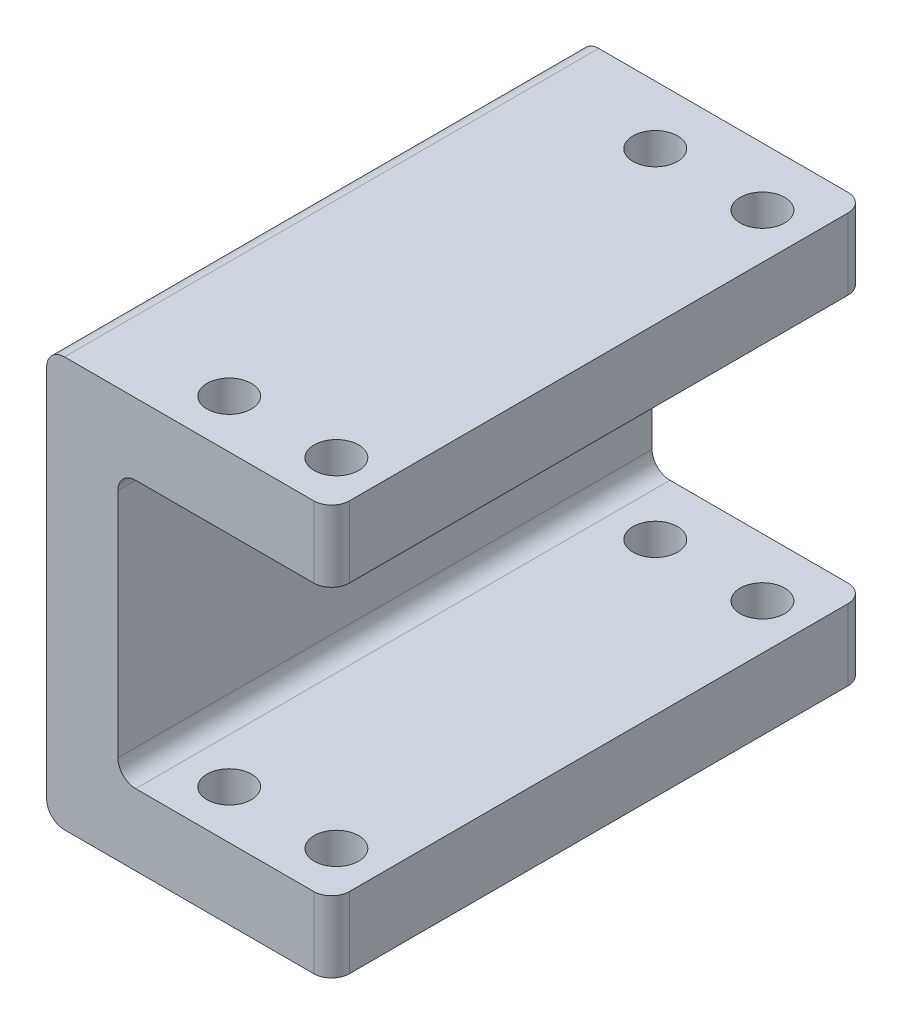
ISO-10303-21;
HEADER;
FILE_DESCRIPTION(('STEP AP214'),'2;1');
FILE_NAME('part.step','',(''),(''),'','','');
FILE_SCHEMA(('AUTOMOTIVE_DESIGN { 1 0 10303 214 1 1 1 1 }'));
ENDSEC;
DATA;
#1=APPLICATION_CONTEXT('core data for automotive mechanical design processes');
#2=APPLICATION_PROTOCOL_DEFINITION('international standard','automotive_design',2000,#1);
#3=PRODUCT_CONTEXT('',#1,'mechanical');
#4=PRODUCT('Part','Part','',(#3));
#5=PRODUCT_RELATED_PRODUCT_CATEGORY('part','',(#4));
#6=PRODUCT_DEFINITION_FORMATION('','',#4);
#7=PRODUCT_DEFINITION_CONTEXT('part definition',#1,'design');
#8=PRODUCT_DEFINITION('design','',#6,#7);
#9=PRODUCT_DEFINITION_SHAPE('','',#8);
#10=(LENGTH_UNIT() NAMED_UNIT(*) SI_UNIT(.MILLI.,.METRE.));
#11=(NAMED_UNIT(*) PLANE_ANGLE_UNIT() SI_UNIT($,.RADIAN.));
#12=(NAMED_UNIT(*) SI_UNIT($,.STERADIAN.) SOLID_ANGLE_UNIT());
#13=UNCERTAINTY_MEASURE_WITH_UNIT(LENGTH_MEASURE(1.E-05),#10,'distance_accuracy_value','');
#14=(GEOMETRIC_REPRESENTATION_CONTEXT(3) GLOBAL_UNCERTAINTY_ASSIGNED_CONTEXT((#13)) GLOBAL_UNIT_ASSIGNED_CONTEXT((#10,
#11,#12)) REPRESENTATION_CONTEXT('',''));
#15=CARTESIAN_POINT('',(0.,0.,0.));
#16=DIRECTION('',(0.,0.,1.));
#17=DIRECTION('',(1.,0.,0.));
#18=AXIS2_PLACEMENT_3D('',#15,#16,#17);
#19=CARTESIAN_POINT('',(0.,15.,0.));
#20=DIRECTION('',(0.,0.,-1.));
#21=DIRECTION('',(1.,0.,0.));
#22=AXIS2_PLACEMENT_3D('',#19,#20,#21);
#23=PLANE('',#22);
#24=DIRECTION('',(1.,0.,0.));
#25=VECTOR('',#24,1.);
#26=CARTESIAN_POINT('',(0.,-4.,0.));
#27=LINE('',#26,#25);
#28=CARTESIAN_POINT('',(11.,-4.,0.));
#29=VERTEX_POINT('',#28);
#30=CARTESIAN_POINT('',(-3.,-4.,0.));
#31=VERTEX_POINT('',#30);
#32=EDGE_CURVE('E157',#29,#31,#27,.F.);
#33=ORIENTED_EDGE('',*,*,#32,.T.);
#34=CARTESIAN_POINT('',(-3.,-3.,0.));
#35=DIRECTION('',(0.,0.,-1.));
#36=DIRECTION('',(-1.,0.,0.));
#37=AXIS2_PLACEMENT_3D('',#34,#35,#36);
#38=CIRCLE('',#37,1.);
#39=CARTESIAN_POINT('',(-4.,-3.,0.));
#40=VERTEX_POINT('',#39);
#41=EDGE_CURVE('E45',#31,#40,#38,.T.);
#42=ORIENTED_EDGE('',*,*,#41,.T.);
#43=DIRECTION('',(0.,1.,0.));
#44=VECTOR('',#43,1.);
#45=CARTESIAN_POINT('',(-4.,0.,0.));
#46=LINE('',#45,#44);
#47=CARTESIAN_POINT('',(-4.,18.,0.));
#48=VERTEX_POINT('',#47);
#49=EDGE_CURVE('E238',#40,#48,#46,.T.);
#50=ORIENTED_EDGE('',*,*,#49,.T.);
#51=CARTESIAN_POINT('',(-3.,18.,0.));
#52=DIRECTION('',(0.,0.,-1.));
#53=DIRECTION('',(-1.,0.,0.));
#54=AXIS2_PLACEMENT_3D('',#51,#52,#53);
#55=CIRCLE('',#54,1.);
#56=CARTESIAN_POINT('',(-3.,19.,0.));
#57=VERTEX_POINT('',#56);
#58=EDGE_CURVE('E52',#48,#57,#55,.T.);
#59=ORIENTED_EDGE('',*,*,#58,.T.);
#60=DIRECTION('',(1.,0.,0.));
#61=VECTOR('',#60,1.);
#62=CARTESIAN_POINT('',(0.,19.,0.));
#63=LINE('',#62,#61);
#64=CARTESIAN_POINT('',(11.,19.,0.));
#65=VERTEX_POINT('',#64);
#66=EDGE_CURVE('E262',#57,#65,#63,.T.);
#67=ORIENTED_EDGE('',*,*,#66,.T.);
#68=DIRECTION('',(0.,-1.,0.));
#69=VECTOR('',#68,1.);
#70=CARTESIAN_POINT('',(11.,15.,0.));
#71=LINE('',#70,#69);
#72=CARTESIAN_POINT('',(11.,15.,0.));
#73=VERTEX_POINT('',#72);
#74=EDGE_CURVE('E186',#65,#73,#71,.T.);
#75=ORIENTED_EDGE('',*,*,#74,.T.);
#76=DIRECTION('',(1.,0.,0.));
#77=VECTOR('',#76,1.);
#78=CARTESIAN_POINT('',(0.,15.,0.));
#79=LINE('',#78,#77);
#80=CARTESIAN_POINT('',(1.,15.,0.));
#81=VERTEX_POINT('',#80);
#82=EDGE_CURVE('E269',#81,#73,#79,.T.);
#83=ORIENTED_EDGE('',*,*,#82,.F.);
#84=CARTESIAN_POINT('',(1.,14.,0.));
#85=DIRECTION('',(0.,0.,-1.));
#86=DIRECTION('',(-1.,0.,0.));
#87=AXIS2_PLACEMENT_3D('',#84,#85,#86);
#88=CIRCLE('',#87,1.);
#89=CARTESIAN_POINT('',(0.,14.,0.));
#90=VERTEX_POINT('',#89);
#91=EDGE_CURVE('E224',#81,#90,#88,.F.);
#92=ORIENTED_EDGE('',*,*,#91,.T.);
#93=DIRECTION('',(0.,1.,0.));
#94=VECTOR('',#93,1.);
#95=CARTESIAN_POINT('',(0.,0.,0.));
#96=LINE('',#95,#94);
#97=CARTESIAN_POINT('',(0.,1.,0.));
#98=VERTEX_POINT('',#97);
#99=EDGE_CURVE('E282',#98,#90,#96,.T.);
#100=ORIENTED_EDGE('',*,*,#99,.F.);
#101=CARTESIAN_POINT('',(1.,1.,0.));
#102=DIRECTION('',(0.,0.,-1.));
#103=DIRECTION('',(-1.,0.,0.));
#104=AXIS2_PLACEMENT_3D('',#101,#102,#103);
#105=CIRCLE('',#104,1.);
#106=CARTESIAN_POINT('',(1.,0.,0.));
#107=VERTEX_POINT('',#106);
#108=EDGE_CURVE('E220',#98,#107,#105,.F.);
#109=ORIENTED_EDGE('',*,*,#108,.T.);
#110=DIRECTION('',(-1.,0.,0.));
#111=VECTOR('',#110,1.);
#112=CARTESIAN_POINT('',(0.,0.,0.));
#113=LINE('',#112,#111);
#114=CARTESIAN_POINT('',(11.,0.,0.));
#115=VERTEX_POINT('',#114);
#116=EDGE_CURVE('E181',#115,#107,#113,.T.);
#117=ORIENTED_EDGE('',*,*,#116,.F.);
#118=DIRECTION('',(0.,-1.,0.));
#119=VECTOR('',#118,1.);
#120=CARTESIAN_POINT('',(11.,15.,0.));
#121=LINE('',#120,#119);
#122=EDGE_CURVE('E189',#115,#29,#121,.T.);
#123=ORIENTED_EDGE('',*,*,#122,.T.);
#124=EDGE_LOOP('',(#33,#42,#50,#59,#67,#75,#83,#92,#100,#109,#117,#123));
#125=FACE_BOUND('',#124,.T.);
#126=ADVANCED_FACE('F37',(#125),#23,.T.);
#127=CARTESIAN_POINT('',(12.,15.,0.));
#128=DIRECTION('',(1.,0.,0.));
#129=DIRECTION('',(0.,0.,1.));
#130=AXIS2_PLACEMENT_3D('',#127,#128,#129);
#131=PLANE('',#130);
#132=DIRECTION('',(0.,0.,1.));
#133=VECTOR('',#132,1.);
#134=CARTESIAN_POINT('',(12.,15.,0.));
#135=LINE('',#134,#133);
#136=CARTESIAN_POINT('',(12.,15.,1.));
#137=VERTEX_POINT('',#136);
#138=CARTESIAN_POINT('',(12.,15.,29.));
#139=VERTEX_POINT('',#138);
#140=EDGE_CURVE('E274',#137,#139,#135,.T.);
#141=ORIENTED_EDGE('',*,*,#140,.F.);
#142=DIRECTION('',(0.,-1.,0.));
#143=VECTOR('',#142,1.);
#144=CARTESIAN_POINT('',(12.,15.,1.));
#145=LINE('',#144,#143);
#146=CARTESIAN_POINT('',(12.,19.,1.));
#147=VERTEX_POINT('',#146);
#148=EDGE_CURVE('E211',#137,#147,#145,.F.);
#149=ORIENTED_EDGE('',*,*,#148,.T.);
#150=DIRECTION('',(0.,0.,-1.));
#151=VECTOR('',#150,1.);
#152=CARTESIAN_POINT('',(12.,19.,0.));
#153=LINE('',#152,#151);
#154=CARTESIAN_POINT('',(12.,19.,29.));
#155=VERTEX_POINT('',#154);
#156=EDGE_CURVE('E259',#147,#155,#153,.F.);
#157=ORIENTED_EDGE('',*,*,#156,.T.);
#158=DIRECTION('',(0.,1.,0.));
#159=VECTOR('',#158,1.);
#160=CARTESIAN_POINT('',(12.,15.,29.));
#161=LINE('',#160,#159);
#162=EDGE_CURVE('E208',#155,#139,#161,.F.);
#163=ORIENTED_EDGE('',*,*,#162,.T.);
#164=EDGE_LOOP('',(#141,#149,#157,#163));
#165=FACE_BOUND('',#164,.T.);
#166=ADVANCED_FACE('F319',(#165),#131,.T.);
#167=CARTESIAN_POINT('',(0.,0.,30.));
#168=DIRECTION('',(0.,0.,-1.));
#169=DIRECTION('',(-1.,0.,0.));
#170=AXIS2_PLACEMENT_3D('',#167,#168,#169);
#171=PLANE('',#170);
#172=DIRECTION('',(0.,1.,0.));
#173=VECTOR('',#172,1.);
#174=CARTESIAN_POINT('',(-4.,0.,30.));
#175=LINE('',#174,#173);
#176=CARTESIAN_POINT('',(-4.,-3.,30.));
#177=VERTEX_POINT('',#176);
#178=CARTESIAN_POINT('',(-4.,18.,30.));
#179=VERTEX_POINT('',#178);
#180=EDGE_CURVE('E246',#177,#179,#175,.T.);
#181=ORIENTED_EDGE('',*,*,#180,.F.);
#182=CARTESIAN_POINT('',(-3.,-3.,30.));
#183=DIRECTION('',(0.,0.,-1.));
#184=DIRECTION('',(-1.,0.,0.));
#185=AXIS2_PLACEMENT_3D('',#182,#183,#184);
#186=CIRCLE('',#185,1.);
#187=CARTESIAN_POINT('',(-3.,-4.,30.));
#188=VERTEX_POINT('',#187);
#189=EDGE_CURVE('E233',#177,#188,#186,.F.);
#190=ORIENTED_EDGE('',*,*,#189,.T.);
#191=DIRECTION('',(1.,0.,0.));
#192=VECTOR('',#191,1.);
#193=CARTESIAN_POINT('',(0.,-4.,30.));
#194=LINE('',#193,#192);
#195=CARTESIAN_POINT('',(11.,-4.,30.));
#196=VERTEX_POINT('',#195);
#197=EDGE_CURVE('E172',#196,#188,#194,.F.);
#198=ORIENTED_EDGE('',*,*,#197,.F.);
#199=DIRECTION('',(0.,-1.,0.));
#200=VECTOR('',#199,1.);
#201=CARTESIAN_POINT('',(11.,0.,30.));
#202=LINE('',#201,#200);
#203=CARTESIAN_POINT('',(11.,0.,30.));
#204=VERTEX_POINT('',#203);
#205=EDGE_CURVE('E194',#196,#204,#202,.F.);
#206=ORIENTED_EDGE('',*,*,#205,.T.);
#207=DIRECTION('',(-1.,0.,0.));
#208=VECTOR('',#207,1.);
#209=CARTESIAN_POINT('',(0.,0.,30.));
#210=LINE('',#209,#208);
#211=CARTESIAN_POINT('',(1.,0.,30.));
#212=VERTEX_POINT('',#211);
#213=EDGE_CURVE('E280',#204,#212,#210,.T.);
#214=ORIENTED_EDGE('',*,*,#213,.T.);
#215=CARTESIAN_POINT('',(1.,1.,30.));
#216=DIRECTION('',(0.,0.,-1.));
#217=DIRECTION('',(-1.,0.,0.));
#218=AXIS2_PLACEMENT_3D('',#215,#216,#217);
#219=CIRCLE('',#218,1.);
#220=CARTESIAN_POINT('',(0.,1.,30.));
#221=VERTEX_POINT('',#220);
#222=EDGE_CURVE('E218',#212,#221,#219,.T.);
#223=ORIENTED_EDGE('',*,*,#222,.T.);
#224=DIRECTION('',(0.,1.,0.));
#225=VECTOR('',#224,1.);
#226=CARTESIAN_POINT('',(0.,0.,30.));
#227=LINE('',#226,#225);
#228=CARTESIAN_POINT('',(0.,14.,30.));
#229=VERTEX_POINT('',#228);
#230=EDGE_CURVE('E278',#221,#229,#227,.T.);
#231=ORIENTED_EDGE('',*,*,#230,.T.);
#232=CARTESIAN_POINT('',(1.,14.,30.));
#233=DIRECTION('',(0.,0.,-1.));
#234=DIRECTION('',(-1.,0.,0.));
#235=AXIS2_PLACEMENT_3D('',#232,#233,#234);
#236=CIRCLE('',#235,1.);
#237=CARTESIAN_POINT('',(1.,15.,30.));
#238=VERTEX_POINT('',#237);
#239=EDGE_CURVE('E222',#229,#238,#236,.T.);
#240=ORIENTED_EDGE('',*,*,#239,.T.);
#241=DIRECTION('',(1.,0.,0.));
#242=VECTOR('',#241,1.);
#243=CARTESIAN_POINT('',(0.,15.,30.));
#244=LINE('',#243,#242);
#245=CARTESIAN_POINT('',(11.,15.,30.));
#246=VERTEX_POINT('',#245);
#247=EDGE_CURVE('E267',#238,#246,#244,.T.);
#248=ORIENTED_EDGE('',*,*,#247,.T.);
#249=DIRECTION('',(0.,-1.,0.));
#250=VECTOR('',#249,1.);
#251=CARTESIAN_POINT('',(11.,0.,30.));
#252=LINE('',#251,#250);
#253=CARTESIAN_POINT('',(11.,19.,30.));
#254=VERTEX_POINT('',#253);
#255=EDGE_CURVE('E161',#246,#254,#252,.F.);
#256=ORIENTED_EDGE('',*,*,#255,.T.);
#257=DIRECTION('',(1.,0.,0.));
#258=VECTOR('',#257,1.);
#259=CARTESIAN_POINT('',(0.,19.,30.));
#260=LINE('',#259,#258);
#261=CARTESIAN_POINT('',(-3.,19.,30.));
#262=VERTEX_POINT('',#261);
#263=EDGE_CURVE('E260',#262,#254,#260,.T.);
#264=ORIENTED_EDGE('',*,*,#263,.F.);
#265=CARTESIAN_POINT('',(-3.,18.,30.));
#266=DIRECTION('',(0.,0.,-1.));
#267=DIRECTION('',(-1.,0.,0.));
#268=AXIS2_PLACEMENT_3D('',#265,#266,#267);
#269=CIRCLE('',#268,1.);
#270=EDGE_CURVE('E231',#262,#179,#269,.F.);
#271=ORIENTED_EDGE('',*,*,#270,.T.);
#272=EDGE_LOOP('',(#181,#190,#198,#206,#214,#223,#231,#240,#248,#256,#264,#271));
#273=FACE_BOUND('',#272,.T.);
#274=ADVANCED_FACE('F251',(#273),#171,.F.);
#275=CARTESIAN_POINT('',(12.,0.,0.));
#276=DIRECTION('',(-1.,0.,0.));
#277=DIRECTION('',(0.,0.,1.));
#278=AXIS2_PLACEMENT_3D('',#275,#276,#277);
#279=PLANE('',#278);
#280=DIRECTION('',(0.,0.,1.));
#281=VECTOR('',#280,1.);
#282=CARTESIAN_POINT('',(12.,-4.,0.));
#283=LINE('',#282,#281);
#284=CARTESIAN_POINT('',(12.,-4.,1.));
#285=VERTEX_POINT('',#284);
#286=CARTESIAN_POINT('',(12.,-4.,29.));
#287=VERTEX_POINT('',#286);
#288=EDGE_CURVE('E155',#285,#287,#283,.T.);
#289=ORIENTED_EDGE('',*,*,#288,.F.);
#290=DIRECTION('',(0.,1.,0.));
#291=VECTOR('',#290,1.);
#292=CARTESIAN_POINT('',(12.,0.,1.));
#293=LINE('',#292,#291);
#294=CARTESIAN_POINT('',(12.,0.,1.));
#295=VERTEX_POINT('',#294);
#296=EDGE_CURVE('E168',#285,#295,#293,.T.);
#297=ORIENTED_EDGE('',*,*,#296,.T.);
#298=DIRECTION('',(0.,0.,1.));
#299=VECTOR('',#298,1.);
#300=CARTESIAN_POINT('',(12.,0.,0.));
#301=LINE('',#300,#299);
#302=CARTESIAN_POINT('',(12.,0.,29.));
#303=VERTEX_POINT('',#302);
#304=EDGE_CURVE('E256',#295,#303,#301,.T.);
#305=ORIENTED_EDGE('',*,*,#304,.T.);
#306=DIRECTION('',(0.,-1.,0.));
#307=VECTOR('',#306,1.);
#308=CARTESIAN_POINT('',(12.,0.,29.));
#309=LINE('',#308,#307);
#310=EDGE_CURVE('E171',#303,#287,#309,.T.);
#311=ORIENTED_EDGE('',*,*,#310,.T.);
#312=EDGE_LOOP('',(#289,#297,#305,#311));
#313=FACE_BOUND('',#312,.T.);
#314=ADVANCED_FACE('F166',(#313),#279,.F.);
#315=CARTESIAN_POINT('',(0.,0.,0.));
#316=DIRECTION('',(0.,1.,0.));
#317=DIRECTION('',(0.,0.,1.));
#318=AXIS2_PLACEMENT_3D('',#315,#316,#317);
#319=PLANE('',#318);
#320=CARTESIAN_POINT('',(9.46229781256356,0.,3.26865299966039));
#321=DIRECTION('',(0.,1.,0.));
#322=DIRECTION('',(0.,0.,1.));
#323=AXIS2_PLACEMENT_3D('',#320,#321,#322);
#324=CIRCLE('',#323,1.25000000000001);
#325=CARTESIAN_POINT('',(9.46229781256356,0.,4.5186529996604));
#326=VERTEX_POINT('',#325);
#327=EDGE_CURVE('E263',#326,#326,#324,.T.);
#328=ORIENTED_EDGE('',*,*,#327,.F.);
#329=EDGE_LOOP('',(#328));
#330=FACE_BOUND('',#329,.T.);
#331=CARTESIAN_POINT('',(3.53774660925669,0.,27.2873892911349));
#332=DIRECTION('',(0.,1.,0.));
#333=DIRECTION('',(0.,0.,1.));
#334=AXIS2_PLACEMENT_3D('',#331,#332,#333);
#335=CIRCLE('',#334,1.25000000000001);
#336=CARTESIAN_POINT('',(3.53774660925669,0.,28.5373892911349));
#337=VERTEX_POINT('',#336);
#338=EDGE_CURVE('E624',#337,#337,#335,.T.);
#339=ORIENTED_EDGE('',*,*,#338,.F.);
#340=EDGE_LOOP('',(#339));
#341=FACE_BOUND('',#340,.T.);
#342=CARTESIAN_POINT('',(9.53771698391582,0.,27.2685344982969));
#343=DIRECTION('',(0.,1.,0.));
#344=DIRECTION('',(0.,0.,1.));
#345=AXIS2_PLACEMENT_3D('',#342,#343,#344);
#346=CIRCLE('',#345,1.25000000000001);
#347=CARTESIAN_POINT('',(9.53771698391582,0.,28.5185344982969));
#348=VERTEX_POINT('',#347);
#349=EDGE_CURVE('E615',#348,#348,#346,.T.);
#350=ORIENTED_EDGE('',*,*,#349,.F.);
#351=EDGE_LOOP('',(#350));
#352=FACE_BOUND('',#351,.T.);
#353=CARTESIAN_POINT('',(3.46232743790446,0.,3.28750779249847));
#354=DIRECTION('',(0.,1.,0.));
#355=DIRECTION('',(0.,0.,1.));
#356=AXIS2_PLACEMENT_3D('',#353,#354,#355);
#357=CIRCLE('',#356,1.25);
#358=CARTESIAN_POINT('',(3.46232743790446,0.,4.53750779249846));
#359=VERTEX_POINT('',#358);
#360=EDGE_CURVE('E606',#359,#359,#357,.T.);
#361=ORIENTED_EDGE('',*,*,#360,.F.);
#362=EDGE_LOOP('',(#361));
#363=FACE_BOUND('',#362,.T.);
#364=ORIENTED_EDGE('',*,*,#304,.F.);
#365=CARTESIAN_POINT('',(11.,0.,1.));
#366=DIRECTION('',(0.,1.,0.));
#367=DIRECTION('',(0.,0.,1.));
#368=AXIS2_PLACEMENT_3D('',#365,#366,#367);
#369=CIRCLE('',#368,1.);
#370=EDGE_CURVE('E175',#295,#115,#369,.T.);
#371=ORIENTED_EDGE('',*,*,#370,.T.);
#372=ORIENTED_EDGE('',*,*,#116,.T.);
#373=DIRECTION('',(0.,0.,1.));
#374=VECTOR('',#373,1.);
#375=CARTESIAN_POINT('',(1.,0.,30.));
#376=LINE('',#375,#374);
#377=EDGE_CURVE('E176',#107,#212,#376,.T.);
#378=ORIENTED_EDGE('',*,*,#377,.T.);
#379=ORIENTED_EDGE('',*,*,#213,.F.);
#380=CARTESIAN_POINT('',(11.,0.,29.));
#381=DIRECTION('',(0.,1.,0.));
#382=DIRECTION('',(0.,0.,1.));
#383=AXIS2_PLACEMENT_3D('',#380,#381,#382);
#384=CIRCLE('',#383,1.);
#385=EDGE_CURVE('E179',#204,#303,#384,.T.);
#386=ORIENTED_EDGE('',*,*,#385,.T.);
#387=EDGE_LOOP('',(#364,#371,#372,#378,#379,#386));
#388=FACE_BOUND('',#387,.T.);
#389=ADVANCED_FACE('F302',(#330,#341,#352,#363,#388),#319,.T.);
#390=CARTESIAN_POINT('',(0.,0.,0.));
#391=DIRECTION('',(1.,0.,0.));
#392=DIRECTION('',(0.,0.,-1.));
#393=AXIS2_PLACEMENT_3D('',#390,#391,#392);
#394=PLANE('',#393);
#395=ORIENTED_EDGE('',*,*,#230,.F.);
#396=DIRECTION('',(0.,0.,1.));
#397=VECTOR('',#396,1.);
#398=CARTESIAN_POINT('',(0.,1.,0.));
#399=LINE('',#398,#397);
#400=EDGE_CURVE('E200',#221,#98,#399,.F.);
#401=ORIENTED_EDGE('',*,*,#400,.T.);
#402=ORIENTED_EDGE('',*,*,#99,.T.);
#403=DIRECTION('',(0.,0.,1.));
#404=VECTOR('',#403,1.);
#405=CARTESIAN_POINT('',(0.,14.,30.));
#406=LINE('',#405,#404);
#407=EDGE_CURVE('E197',#90,#229,#406,.T.);
#408=ORIENTED_EDGE('',*,*,#407,.T.);
#409=EDGE_LOOP('',(#395,#401,#402,#408));
#410=FACE_BOUND('',#409,.T.);
#411=ADVANCED_FACE('F307',(#410),#394,.T.);
#412=CARTESIAN_POINT('',(0.,15.,0.));
#413=DIRECTION('',(0.,-1.,0.));
#414=DIRECTION('',(0.,0.,-1.));
#415=AXIS2_PLACEMENT_3D('',#412,#413,#414);
#416=PLANE('',#415);
#417=CARTESIAN_POINT('',(9.46229781256356,15.,3.26865299966039));
#418=DIRECTION('',(0.,-1.,0.));
#419=DIRECTION('',(0.,0.,-1.));
#420=AXIS2_PLACEMENT_3D('',#417,#418,#419);
#421=CIRCLE('',#420,1.25000000000001);
#422=CARTESIAN_POINT('',(9.46229781256356,15.,2.01865299966038));
#423=VERTEX_POINT('',#422);
#424=EDGE_CURVE('E629',#423,#423,#421,.T.);
#425=ORIENTED_EDGE('',*,*,#424,.F.);
#426=EDGE_LOOP('',(#425));
#427=FACE_BOUND('',#426,.T.);
#428=CARTESIAN_POINT('',(3.53774660925669,15.,27.2873892911349));
#429=DIRECTION('',(0.,-1.,0.));
#430=DIRECTION('',(0.,0.,-1.));
#431=AXIS2_PLACEMENT_3D('',#428,#429,#430);
#432=CIRCLE('',#431,1.25000000000001);
#433=CARTESIAN_POINT('',(3.53774660925669,15.,26.0373892911349));
#434=VERTEX_POINT('',#433);
#435=EDGE_CURVE('E621',#434,#434,#432,.T.);
#436=ORIENTED_EDGE('',*,*,#435,.F.);
#437=EDGE_LOOP('',(#436));
#438=FACE_BOUND('',#437,.T.);
#439=CARTESIAN_POINT('',(9.53771698391582,15.,27.2685344982969));
#440=DIRECTION('',(0.,-1.,0.));
#441=DIRECTION('',(0.,0.,-1.));
#442=AXIS2_PLACEMENT_3D('',#439,#440,#441);
#443=CIRCLE('',#442,1.25000000000001);
#444=CARTESIAN_POINT('',(9.53771698391582,15.,26.0185344982968));
#445=VERTEX_POINT('',#444);
#446=EDGE_CURVE('E612',#445,#445,#443,.T.);
#447=ORIENTED_EDGE('',*,*,#446,.F.);
#448=EDGE_LOOP('',(#447));
#449=FACE_BOUND('',#448,.T.);
#450=CARTESIAN_POINT('',(3.46232743790446,15.,3.28750779249847));
#451=DIRECTION('',(0.,-1.,0.));
#452=DIRECTION('',(0.,0.,-1.));
#453=AXIS2_PLACEMENT_3D('',#450,#451,#452);
#454=CIRCLE('',#453,1.25);
#455=CARTESIAN_POINT('',(3.46232743790446,15.,2.03750779249847));
#456=VERTEX_POINT('',#455);
#457=EDGE_CURVE('E590',#456,#456,#454,.T.);
#458=ORIENTED_EDGE('',*,*,#457,.F.);
#459=EDGE_LOOP('',(#458));
#460=FACE_BOUND('',#459,.T.);
#461=ORIENTED_EDGE('',*,*,#247,.F.);
#462=DIRECTION('',(0.,0.,1.));
#463=VECTOR('',#462,1.);
#464=CARTESIAN_POINT('',(1.,15.,0.));
#465=LINE('',#464,#463);
#466=EDGE_CURVE('E206',#238,#81,#465,.F.);
#467=ORIENTED_EDGE('',*,*,#466,.T.);
#468=ORIENTED_EDGE('',*,*,#82,.T.);
#469=CARTESIAN_POINT('',(11.,15.,1.));
#470=DIRECTION('',(0.,-1.,0.));
#471=DIRECTION('',(0.,0.,-1.));
#472=AXIS2_PLACEMENT_3D('',#469,#470,#471);
#473=CIRCLE('',#472,1.);
#474=EDGE_CURVE('E204',#73,#137,#473,.T.);
#475=ORIENTED_EDGE('',*,*,#474,.T.);
#476=ORIENTED_EDGE('',*,*,#140,.T.);
#477=CARTESIAN_POINT('',(11.,15.,29.));
#478=DIRECTION('',(0.,-1.,0.));
#479=DIRECTION('',(0.,0.,-1.));
#480=AXIS2_PLACEMENT_3D('',#477,#478,#479);
#481=CIRCLE('',#480,1.);
#482=EDGE_CURVE('E202',#139,#246,#481,.T.);
#483=ORIENTED_EDGE('',*,*,#482,.T.);
#484=EDGE_LOOP('',(#461,#467,#468,#475,#476,#483));
#485=FACE_BOUND('',#484,.T.);
#486=ADVANCED_FACE('F312',(#427,#438,#449,#460,#485),#416,.T.);
#487=CARTESIAN_POINT('',(0.,-4.,0.));
#488=DIRECTION('',(0.,1.,0.));
#489=DIRECTION('',(0.,0.,1.));
#490=AXIS2_PLACEMENT_3D('',#487,#488,#489);
#491=PLANE('',#490);
#492=CARTESIAN_POINT('',(9.46229781256356,-4.,3.26865299966039));
#493=DIRECTION('',(0.,1.,0.));
#494=DIRECTION('',(0.,0.,1.));
#495=AXIS2_PLACEMENT_3D('',#492,#493,#494);
#496=CIRCLE('',#495,1.25000000000001);
#497=CARTESIAN_POINT('',(9.46229781256356,-4.,4.5186529996604));
#498=VERTEX_POINT('',#497);
#499=EDGE_CURVE('E627',#498,#498,#496,.T.);
#500=ORIENTED_EDGE('',*,*,#499,.T.);
#501=EDGE_LOOP('',(#500));
#502=FACE_BOUND('',#501,.T.);
#503=CARTESIAN_POINT('',(3.53774660925669,-4.,27.2873892911349));
#504=DIRECTION('',(0.,1.,0.));
#505=DIRECTION('',(0.,0.,1.));
#506=AXIS2_PLACEMENT_3D('',#503,#504,#505);
#507=CIRCLE('',#506,1.25000000000001);
#508=CARTESIAN_POINT('',(3.53774660925669,-4.,28.5373892911349));
#509=VERTEX_POINT('',#508);
#510=EDGE_CURVE('E618',#509,#509,#507,.T.);
#511=ORIENTED_EDGE('',*,*,#510,.T.);
#512=EDGE_LOOP('',(#511));
#513=FACE_BOUND('',#512,.T.);
#514=CARTESIAN_POINT('',(9.53771698391582,-4.,27.2685344982969));
#515=DIRECTION('',(0.,1.,0.));
#516=DIRECTION('',(0.,0.,1.));
#517=AXIS2_PLACEMENT_3D('',#514,#515,#516);
#518=CIRCLE('',#517,1.25000000000001);
#519=CARTESIAN_POINT('',(9.53771698391582,-4.,28.5185344982969));
#520=VERTEX_POINT('',#519);
#521=EDGE_CURVE('E609',#520,#520,#518,.T.);
#522=ORIENTED_EDGE('',*,*,#521,.T.);
#523=EDGE_LOOP('',(#522));
#524=FACE_BOUND('',#523,.T.);
#525=CARTESIAN_POINT('',(3.46232743790446,-4.,3.28750779249847));
#526=DIRECTION('',(0.,1.,0.));
#527=DIRECTION('',(0.,0.,1.));
#528=AXIS2_PLACEMENT_3D('',#525,#526,#527);
#529=CIRCLE('',#528,1.25);
#530=CARTESIAN_POINT('',(3.46232743790446,-4.,4.53750779249846));
#531=VERTEX_POINT('',#530);
#532=EDGE_CURVE('E595',#531,#531,#529,.T.);
#533=ORIENTED_EDGE('',*,*,#532,.T.);
#534=EDGE_LOOP('',(#533));
#535=FACE_BOUND('',#534,.T.);
#536=ORIENTED_EDGE('',*,*,#197,.T.);
#537=DIRECTION('',(0.,0.,1.));
#538=VECTOR('',#537,1.);
#539=CARTESIAN_POINT('',(-3.,-4.,0.));
#540=LINE('',#539,#538);
#541=EDGE_CURVE('E60',#188,#31,#540,.F.);
#542=ORIENTED_EDGE('',*,*,#541,.T.);
#543=ORIENTED_EDGE('',*,*,#32,.F.);
#544=CARTESIAN_POINT('',(11.,-4.,1.));
#545=DIRECTION('',(0.,1.,0.));
#546=DIRECTION('',(0.,0.,1.));
#547=AXIS2_PLACEMENT_3D('',#544,#545,#546);
#548=CIRCLE('',#547,1.);
#549=EDGE_CURVE('E152',#29,#285,#548,.F.);
#550=ORIENTED_EDGE('',*,*,#549,.T.);
#551=ORIENTED_EDGE('',*,*,#288,.T.);
#552=CARTESIAN_POINT('',(11.,-4.,29.));
#553=DIRECTION('',(0.,1.,0.));
#554=DIRECTION('',(0.,0.,1.));
#555=AXIS2_PLACEMENT_3D('',#552,#553,#554);
#556=CIRCLE('',#555,1.);
#557=EDGE_CURVE('E162',#287,#196,#556,.F.);
#558=ORIENTED_EDGE('',*,*,#557,.T.);
#559=EDGE_LOOP('',(#536,#542,#543,#550,#551,#558));
#560=FACE_BOUND('',#559,.T.);
#561=ADVANCED_FACE('F154',(#502,#513,#524,#535,#560),#491,.F.);
#562=CARTESIAN_POINT('',(-4.,0.,0.));
#563=DIRECTION('',(1.,0.,0.));
#564=DIRECTION('',(0.,0.,-1.));
#565=AXIS2_PLACEMENT_3D('',#562,#563,#564);
#566=PLANE('',#565);
#567=ORIENTED_EDGE('',*,*,#49,.F.);
#568=DIRECTION('',(0.,0.,1.));
#569=VECTOR('',#568,1.);
#570=CARTESIAN_POINT('',(-4.,-3.,0.));
#571=LINE('',#570,#569);
#572=EDGE_CURVE('E228',#40,#177,#571,.T.);
#573=ORIENTED_EDGE('',*,*,#572,.T.);
#574=ORIENTED_EDGE('',*,*,#180,.T.);
#575=DIRECTION('',(0.,0.,1.));
#576=VECTOR('',#575,1.);
#577=CARTESIAN_POINT('',(-4.,18.,0.));
#578=LINE('',#577,#576);
#579=EDGE_CURVE('E226',#179,#48,#578,.F.);
#580=ORIENTED_EDGE('',*,*,#579,.T.);
#581=EDGE_LOOP('',(#567,#573,#574,#580));
#582=FACE_BOUND('',#581,.T.);
#583=ADVANCED_FACE('F242',(#582),#566,.F.);
#584=CARTESIAN_POINT('',(0.,19.,0.));
#585=DIRECTION('',(0.,-1.,0.));
#586=DIRECTION('',(0.,0.,-1.));
#587=AXIS2_PLACEMENT_3D('',#584,#585,#586);
#588=PLANE('',#587);
#589=CARTESIAN_POINT('',(9.46229781256356,19.,3.26865299966039));
#590=DIRECTION('',(0.,1.,0.));
#591=DIRECTION('',(0.,0.,1.));
#592=AXIS2_PLACEMENT_3D('',#589,#590,#591);
#593=CIRCLE('',#592,1.25000000000001);
#594=CARTESIAN_POINT('',(9.46229781256356,19.,4.5186529996604));
#595=VERTEX_POINT('',#594);
#596=EDGE_CURVE('E596',#595,#595,#593,.T.);
#597=ORIENTED_EDGE('',*,*,#596,.F.);
#598=EDGE_LOOP('',(#597));
#599=FACE_BOUND('',#598,.T.);
#600=CARTESIAN_POINT('',(3.53774660925669,19.,27.2873892911349));
#601=DIRECTION('',(0.,1.,0.));
#602=DIRECTION('',(0.,0.,1.));
#603=AXIS2_PLACEMENT_3D('',#600,#601,#602);
#604=CIRCLE('',#603,1.25000000000001);
#605=CARTESIAN_POINT('',(3.53774660925669,19.,28.5373892911349));
#606=VERTEX_POINT('',#605);
#607=EDGE_CURVE('E601',#606,#606,#604,.T.);
#608=ORIENTED_EDGE('',*,*,#607,.F.);
#609=EDGE_LOOP('',(#608));
#610=FACE_BOUND('',#609,.T.);
#611=CARTESIAN_POINT('',(9.53771698391582,19.,27.2685344982969));
#612=DIRECTION('',(0.,1.,0.));
#613=DIRECTION('',(0.,0.,1.));
#614=AXIS2_PLACEMENT_3D('',#611,#612,#613);
#615=CIRCLE('',#614,1.25000000000001);
#616=CARTESIAN_POINT('',(9.53771698391582,19.,28.5185344982969));
#617=VERTEX_POINT('',#616);
#618=EDGE_CURVE('E660',#617,#617,#615,.T.);
#619=ORIENTED_EDGE('',*,*,#618,.F.);
#620=EDGE_LOOP('',(#619));
#621=FACE_BOUND('',#620,.T.);
#622=CARTESIAN_POINT('',(3.46232743790446,19.,3.28750779249847));
#623=DIRECTION('',(0.,1.,0.));
#624=DIRECTION('',(0.,0.,1.));
#625=AXIS2_PLACEMENT_3D('',#622,#623,#624);
#626=CIRCLE('',#625,1.25);
#627=CARTESIAN_POINT('',(3.46232743790446,19.,4.53750779249846));
#628=VERTEX_POINT('',#627);
#629=EDGE_CURVE('E593',#628,#628,#626,.T.);
#630=ORIENTED_EDGE('',*,*,#629,.F.);
#631=EDGE_LOOP('',(#630));
#632=FACE_BOUND('',#631,.T.);
#633=ORIENTED_EDGE('',*,*,#66,.F.);
#634=DIRECTION('',(0.,0.,1.));
#635=VECTOR('',#634,1.);
#636=CARTESIAN_POINT('',(-3.,19.,0.));
#637=LINE('',#636,#635);
#638=EDGE_CURVE('E11',#57,#262,#637,.T.);
#639=ORIENTED_EDGE('',*,*,#638,.T.);
#640=ORIENTED_EDGE('',*,*,#263,.T.);
#641=CARTESIAN_POINT('',(11.,19.,29.));
#642=DIRECTION('',(0.,-1.,0.));
#643=DIRECTION('',(0.,0.,-1.));
#644=AXIS2_PLACEMENT_3D('',#641,#642,#643);
#645=CIRCLE('',#644,1.);
#646=EDGE_CURVE('E213',#254,#155,#645,.F.);
#647=ORIENTED_EDGE('',*,*,#646,.T.);
#648=ORIENTED_EDGE('',*,*,#156,.F.);
#649=CARTESIAN_POINT('',(11.,19.,1.));
#650=DIRECTION('',(0.,-1.,0.));
#651=DIRECTION('',(0.,0.,-1.));
#652=AXIS2_PLACEMENT_3D('',#649,#650,#651);
#653=CIRCLE('',#652,1.);
#654=EDGE_CURVE('E215',#147,#65,#653,.F.);
#655=ORIENTED_EDGE('',*,*,#654,.T.);
#656=EDGE_LOOP('',(#633,#639,#640,#647,#648,#655));
#657=FACE_BOUND('',#656,.T.);
#658=ADVANCED_FACE('F324',(#599,#610,#621,#632,#657),#588,.F.);
#659=CARTESIAN_POINT('',(3.46232743790446,-11.,3.28750779249847));
#660=DIRECTION('',(0.,1.,0.));
#661=DIRECTION('',(0.,0.,1.));
#662=AXIS2_PLACEMENT_3D('',#659,#660,#661);
#663=CYLINDRICAL_SURFACE('',#662,1.25);
#664=ORIENTED_EDGE('',*,*,#457,.T.);
#665=EDGE_LOOP('',(#664));
#666=FACE_BOUND('',#665,.T.);
#667=ORIENTED_EDGE('',*,*,#629,.T.);
#668=EDGE_LOOP('',(#667));
#669=FACE_BOUND('',#668,.T.);
#670=ADVANCED_FACE('F378',(#666,#669),#663,.F.);
#671=CARTESIAN_POINT('',(9.53771698391582,-11.,27.2685344982969));
#672=DIRECTION('',(0.,1.,0.));
#673=DIRECTION('',(0.,0.,1.));
#674=AXIS2_PLACEMENT_3D('',#671,#672,#673);
#675=CYLINDRICAL_SURFACE('',#674,1.25000000000001);
#676=ORIENTED_EDGE('',*,*,#446,.T.);
#677=EDGE_LOOP('',(#676));
#678=FACE_BOUND('',#677,.T.);
#679=ORIENTED_EDGE('',*,*,#618,.T.);
#680=EDGE_LOOP('',(#679));
#681=FACE_BOUND('',#680,.T.);
#682=ADVANCED_FACE('F516',(#678,#681),#675,.F.);
#683=CARTESIAN_POINT('',(3.53774660925669,-11.,27.2873892911349));
#684=DIRECTION('',(0.,1.,0.));
#685=DIRECTION('',(0.,0.,1.));
#686=AXIS2_PLACEMENT_3D('',#683,#684,#685);
#687=CYLINDRICAL_SURFACE('',#686,1.25000000000001);
#688=ORIENTED_EDGE('',*,*,#435,.T.);
#689=EDGE_LOOP('',(#688));
#690=FACE_BOUND('',#689,.T.);
#691=ORIENTED_EDGE('',*,*,#607,.T.);
#692=EDGE_LOOP('',(#691));
#693=FACE_BOUND('',#692,.T.);
#694=ADVANCED_FACE('F507',(#690,#693),#687,.F.);
#695=CARTESIAN_POINT('',(9.46229781256356,-11.,3.26865299966039));
#696=DIRECTION('',(0.,1.,0.));
#697=DIRECTION('',(0.,0.,1.));
#698=AXIS2_PLACEMENT_3D('',#695,#696,#697);
#699=CYLINDRICAL_SURFACE('',#698,1.25000000000001);
#700=ORIENTED_EDGE('',*,*,#424,.T.);
#701=EDGE_LOOP('',(#700));
#702=FACE_BOUND('',#701,.T.);
#703=ORIENTED_EDGE('',*,*,#596,.T.);
#704=EDGE_LOOP('',(#703));
#705=FACE_BOUND('',#704,.T.);
#706=ADVANCED_FACE('F501',(#702,#705),#699,.F.);
#707=ORIENTED_EDGE('',*,*,#360,.T.);
#708=EDGE_LOOP('',(#707));
#709=FACE_BOUND('',#708,.T.);
#710=ORIENTED_EDGE('',*,*,#532,.F.);
#711=EDGE_LOOP('',(#710));
#712=FACE_BOUND('',#711,.T.);
#713=ADVANCED_FACE('F513',(#709,#712),#663,.F.);
#714=ORIENTED_EDGE('',*,*,#349,.T.);
#715=EDGE_LOOP('',(#714));
#716=FACE_BOUND('',#715,.T.);
#717=ORIENTED_EDGE('',*,*,#521,.F.);
#718=EDGE_LOOP('',(#717));
#719=FACE_BOUND('',#718,.T.);
#720=ADVANCED_FACE('F504',(#716,#719),#675,.F.);
#721=ORIENTED_EDGE('',*,*,#338,.T.);
#722=EDGE_LOOP('',(#721));
#723=FACE_BOUND('',#722,.T.);
#724=ORIENTED_EDGE('',*,*,#510,.F.);
#725=EDGE_LOOP('',(#724));
#726=FACE_BOUND('',#725,.T.);
#727=ADVANCED_FACE('F498',(#723,#726),#687,.F.);
#728=ORIENTED_EDGE('',*,*,#327,.T.);
#729=EDGE_LOOP('',(#728));
#730=FACE_BOUND('',#729,.T.);
#731=ORIENTED_EDGE('',*,*,#499,.F.);
#732=EDGE_LOOP('',(#731));
#733=FACE_BOUND('',#732,.T.);
#734=ADVANCED_FACE('F347',(#730,#733),#699,.F.);
#735=CARTESIAN_POINT('',(11.,0.,1.));
#736=DIRECTION('',(0.,-1.,0.));
#737=DIRECTION('',(0.,0.,-1.));
#738=AXIS2_PLACEMENT_3D('',#735,#736,#737);
#739=CYLINDRICAL_SURFACE('',#738,1.);
#740=ORIENTED_EDGE('',*,*,#549,.F.);
#741=ORIENTED_EDGE('',*,*,#122,.F.);
#742=ORIENTED_EDGE('',*,*,#370,.F.);
#743=ORIENTED_EDGE('',*,*,#296,.F.);
#744=EDGE_LOOP('',(#740,#741,#742,#743));
#745=FACE_BOUND('',#744,.T.);
#746=ADVANCED_FACE('F174',(#745),#739,.T.);
#747=CARTESIAN_POINT('',(11.,0.,29.));
#748=DIRECTION('',(0.,1.,0.));
#749=DIRECTION('',(0.,0.,1.));
#750=AXIS2_PLACEMENT_3D('',#747,#748,#749);
#751=CYLINDRICAL_SURFACE('',#750,1.);
#752=ORIENTED_EDGE('',*,*,#557,.F.);
#753=ORIENTED_EDGE('',*,*,#310,.F.);
#754=ORIENTED_EDGE('',*,*,#385,.F.);
#755=ORIENTED_EDGE('',*,*,#205,.F.);
#756=EDGE_LOOP('',(#752,#753,#754,#755));
#757=FACE_BOUND('',#756,.T.);
#758=ADVANCED_FACE('F300',(#757),#751,.T.);
#759=CARTESIAN_POINT('',(1.,1.,0.));
#760=DIRECTION('',(0.,0.,-1.));
#761=DIRECTION('',(-1.,0.,0.));
#762=AXIS2_PLACEMENT_3D('',#759,#760,#761);
#763=CYLINDRICAL_SURFACE('',#762,1.);
#764=ORIENTED_EDGE('',*,*,#108,.F.);
#765=ORIENTED_EDGE('',*,*,#400,.F.);
#766=ORIENTED_EDGE('',*,*,#222,.F.);
#767=ORIENTED_EDGE('',*,*,#377,.F.);
#768=EDGE_LOOP('',(#764,#765,#766,#767));
#769=FACE_BOUND('',#768,.T.);
#770=ADVANCED_FACE('F305',(#769),#763,.F.);
#771=CARTESIAN_POINT('',(1.,14.,0.));
#772=DIRECTION('',(0.,0.,-1.));
#773=DIRECTION('',(-1.,0.,0.));
#774=AXIS2_PLACEMENT_3D('',#771,#772,#773);
#775=CYLINDRICAL_SURFACE('',#774,1.);
#776=ORIENTED_EDGE('',*,*,#91,.F.);
#777=ORIENTED_EDGE('',*,*,#466,.F.);
#778=ORIENTED_EDGE('',*,*,#239,.F.);
#779=ORIENTED_EDGE('',*,*,#407,.F.);
#780=EDGE_LOOP('',(#776,#777,#778,#779));
#781=FACE_BOUND('',#780,.T.);
#782=ADVANCED_FACE('F310',(#781),#775,.F.);
#783=CARTESIAN_POINT('',(11.,15.,1.));
#784=DIRECTION('',(0.,-1.,0.));
#785=DIRECTION('',(0.,0.,-1.));
#786=AXIS2_PLACEMENT_3D('',#783,#784,#785);
#787=CYLINDRICAL_SURFACE('',#786,1.);
#788=ORIENTED_EDGE('',*,*,#654,.F.);
#789=ORIENTED_EDGE('',*,*,#148,.F.);
#790=ORIENTED_EDGE('',*,*,#474,.F.);
#791=ORIENTED_EDGE('',*,*,#74,.F.);
#792=EDGE_LOOP('',(#788,#789,#790,#791));
#793=FACE_BOUND('',#792,.T.);
#794=ADVANCED_FACE('F327',(#793),#787,.T.);
#795=CARTESIAN_POINT('',(11.,15.,29.));
#796=DIRECTION('',(0.,1.,0.));
#797=DIRECTION('',(0.,0.,1.));
#798=AXIS2_PLACEMENT_3D('',#795,#796,#797);
#799=CYLINDRICAL_SURFACE('',#798,1.);
#800=ORIENTED_EDGE('',*,*,#646,.F.);
#801=ORIENTED_EDGE('',*,*,#255,.F.);
#802=ORIENTED_EDGE('',*,*,#482,.F.);
#803=ORIENTED_EDGE('',*,*,#162,.F.);
#804=EDGE_LOOP('',(#800,#801,#802,#803));
#805=FACE_BOUND('',#804,.T.);
#806=ADVANCED_FACE('F317',(#805),#799,.T.);
#807=CARTESIAN_POINT('',(-3.,-3.,0.));
#808=DIRECTION('',(0.,0.,1.));
#809=DIRECTION('',(1.,0.,0.));
#810=AXIS2_PLACEMENT_3D('',#807,#808,#809);
#811=CYLINDRICAL_SURFACE('',#810,1.);
#812=ORIENTED_EDGE('',*,*,#41,.F.);
#813=ORIENTED_EDGE('',*,*,#541,.F.);
#814=ORIENTED_EDGE('',*,*,#189,.F.);
#815=ORIENTED_EDGE('',*,*,#572,.F.);
#816=EDGE_LOOP('',(#812,#813,#814,#815));
#817=FACE_BOUND('',#816,.T.);
#818=ADVANCED_FACE('F248',(#817),#811,.T.);
#819=CARTESIAN_POINT('',(-3.,18.,0.));
#820=DIRECTION('',(0.,0.,1.));
#821=DIRECTION('',(1.,0.,0.));
#822=AXIS2_PLACEMENT_3D('',#819,#820,#821);
#823=CYLINDRICAL_SURFACE('',#822,1.);
#824=ORIENTED_EDGE('',*,*,#58,.F.);
#825=ORIENTED_EDGE('',*,*,#579,.F.);
#826=ORIENTED_EDGE('',*,*,#270,.F.);
#827=ORIENTED_EDGE('',*,*,#638,.F.);
#828=EDGE_LOOP('',(#824,#825,#826,#827));
#829=FACE_BOUND('',#828,.T.);
#830=ADVANCED_FACE('F39',(#829),#823,.T.);
#831=CLOSED_SHELL('',(#126,#166,#274,#314,#389,#411,#486,#561,#583,#658,#670,#682,#694,#706,
#713,#720,#727,#734,#746,#758,#770,#782,#794,#806,#818,#830));
#832=MANIFOLD_SOLID_BREP('B2',#831);
#833=ADVANCED_BREP_SHAPE_REPRESENTATION('',(#18,#832),#14);
#834=SHAPE_DEFINITION_REPRESENTATION(#9,#833);
ENDSEC;
END-ISO-10303-21;
